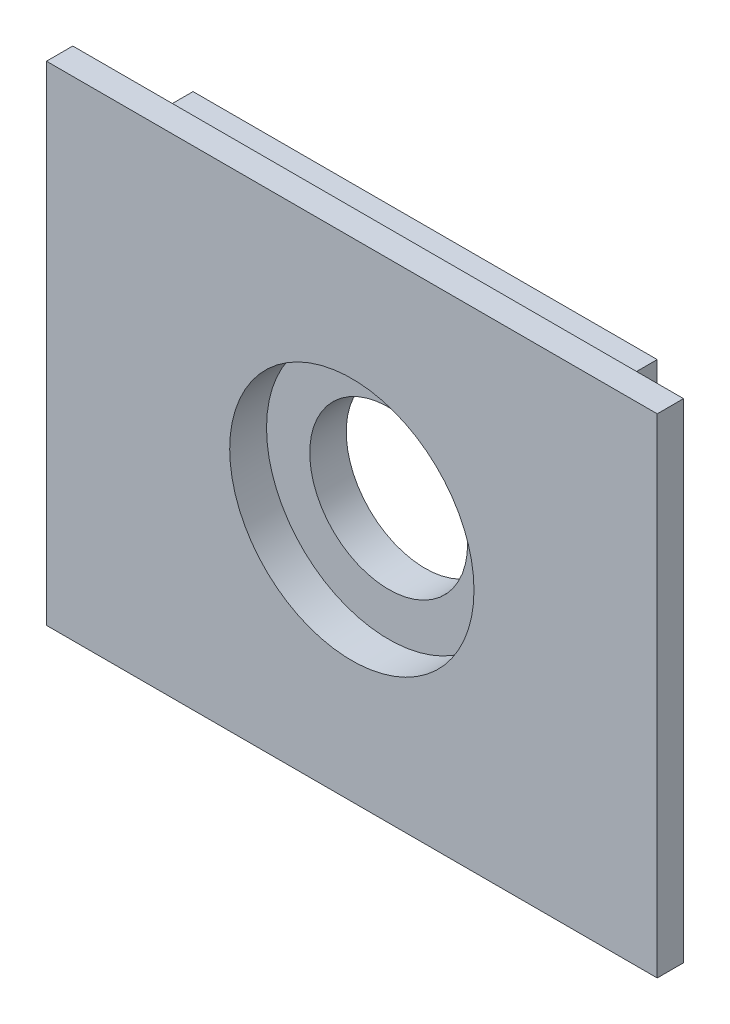
ISO-10303-21;
HEADER;
FILE_DESCRIPTION(('STEP AP214'),'2;1');
FILE_NAME('part.step','',(''),(''),'','','');
FILE_SCHEMA(('AUTOMOTIVE_DESIGN { 1 0 10303 214 1 1 1 1 }'));
ENDSEC;
DATA;
#1=APPLICATION_CONTEXT('core data for automotive mechanical design processes');
#2=APPLICATION_PROTOCOL_DEFINITION('international standard','automotive_design',2000,#1);
#3=PRODUCT_CONTEXT('',#1,'mechanical');
#4=PRODUCT('Part','Part','',(#3));
#5=PRODUCT_RELATED_PRODUCT_CATEGORY('part','',(#4));
#6=PRODUCT_DEFINITION_FORMATION('','',#4);
#7=PRODUCT_DEFINITION_CONTEXT('part definition',#1,'design');
#8=PRODUCT_DEFINITION('design','',#6,#7);
#9=PRODUCT_DEFINITION_SHAPE('','',#8);
#10=(LENGTH_UNIT() NAMED_UNIT(*) SI_UNIT(.MILLI.,.METRE.));
#11=(NAMED_UNIT(*) PLANE_ANGLE_UNIT() SI_UNIT($,.RADIAN.));
#12=(NAMED_UNIT(*) SI_UNIT($,.STERADIAN.) SOLID_ANGLE_UNIT());
#13=UNCERTAINTY_MEASURE_WITH_UNIT(LENGTH_MEASURE(1.E-05),#10,'distance_accuracy_value','');
#14=(GEOMETRIC_REPRESENTATION_CONTEXT(3) GLOBAL_UNCERTAINTY_ASSIGNED_CONTEXT((#13)) GLOBAL_UNIT_ASSIGNED_CONTEXT((#10,
#11,#12)) REPRESENTATION_CONTEXT('',''));
#15=CARTESIAN_POINT('',(0.,0.,0.));
#16=DIRECTION('',(0.,0.,1.));
#17=DIRECTION('',(1.,0.,0.));
#18=AXIS2_PLACEMENT_3D('',#15,#16,#17);
#19=CARTESIAN_POINT('',(0.,0.,-39.));
#20=DIRECTION('',(-1.,0.,0.));
#21=DIRECTION('',(0.,0.,1.));
#22=AXIS2_PLACEMENT_3D('',#19,#20,#21);
#23=PLANE('',#22);
#24=DIRECTION('',(0.,0.,1.));
#25=VECTOR('',#24,1.);
#26=CARTESIAN_POINT('',(0.,260.,-39.));
#27=LINE('',#26,#25);
#28=CARTESIAN_POINT('',(0.,260.,-14.));
#29=VERTEX_POINT('',#28);
#30=CARTESIAN_POINT('',(0.,260.,0.));
#31=VERTEX_POINT('',#30);
#32=EDGE_CURVE('E11',#29,#31,#27,.T.);
#33=ORIENTED_EDGE('',*,*,#32,.F.);
#34=DIRECTION('',(0.,1.,0.));
#35=VECTOR('',#34,1.);
#36=CARTESIAN_POINT('',(0.,260.,-14.));
#37=LINE('',#36,#35);
#38=CARTESIAN_POINT('',(0.,0.,-14.));
#39=VERTEX_POINT('',#38);
#40=EDGE_CURVE('E141',#39,#29,#37,.T.);
#41=ORIENTED_EDGE('',*,*,#40,.F.);
#42=DIRECTION('',(0.,0.,1.));
#43=VECTOR('',#42,1.);
#44=CARTESIAN_POINT('',(0.,0.,-39.));
#45=LINE('',#44,#43);
#46=CARTESIAN_POINT('',(0.,0.,0.));
#47=VERTEX_POINT('',#46);
#48=EDGE_CURVE('E165',#39,#47,#45,.T.);
#49=ORIENTED_EDGE('',*,*,#48,.T.);
#50=DIRECTION('',(0.,-1.,0.));
#51=VECTOR('',#50,1.);
#52=CARTESIAN_POINT('',(0.,0.,0.));
#53=LINE('',#52,#51);
#54=EDGE_CURVE('E151',#31,#47,#53,.T.);
#55=ORIENTED_EDGE('',*,*,#54,.F.);
#56=EDGE_LOOP('',(#33,#41,#49,#55));
#57=FACE_BOUND('',#56,.T.);
#58=ADVANCED_FACE('F33',(#57),#23,.T.);
#59=CARTESIAN_POINT('',(0.,260.,-39.));
#60=DIRECTION('',(0.,1.,0.));
#61=DIRECTION('',(0.,0.,1.));
#62=AXIS2_PLACEMENT_3D('',#59,#60,#61);
#63=PLANE('',#62);
#64=DIRECTION('',(0.,0.,1.));
#65=VECTOR('',#64,1.);
#66=CARTESIAN_POINT('',(325.,260.,-39.));
#67=LINE('',#66,#65);
#68=CARTESIAN_POINT('',(325.,260.,-14.));
#69=VERTEX_POINT('',#68);
#70=CARTESIAN_POINT('',(325.,260.,0.));
#71=VERTEX_POINT('',#70);
#72=EDGE_CURVE('E41',#69,#71,#67,.T.);
#73=ORIENTED_EDGE('',*,*,#72,.F.);
#74=DIRECTION('',(1.,0.,0.));
#75=VECTOR('',#74,1.);
#76=CARTESIAN_POINT('',(325.,260.,-14.));
#77=LINE('',#76,#75);
#78=EDGE_CURVE('E143',#29,#69,#77,.T.);
#79=ORIENTED_EDGE('',*,*,#78,.F.);
#80=ORIENTED_EDGE('',*,*,#32,.T.);
#81=DIRECTION('',(-1.,0.,0.));
#82=VECTOR('',#81,1.);
#83=CARTESIAN_POINT('',(0.,260.,0.));
#84=LINE('',#83,#82);
#85=EDGE_CURVE('E163',#71,#31,#84,.T.);
#86=ORIENTED_EDGE('',*,*,#85,.F.);
#87=EDGE_LOOP('',(#73,#79,#80,#86));
#88=FACE_BOUND('',#87,.T.);
#89=ADVANCED_FACE('F184',(#88),#63,.T.);
#90=CARTESIAN_POINT('',(325.,0.,-39.));
#91=DIRECTION('',(1.,0.,0.));
#92=DIRECTION('',(0.,0.,-1.));
#93=AXIS2_PLACEMENT_3D('',#90,#91,#92);
#94=PLANE('',#93);
#95=DIRECTION('',(0.,0.,1.));
#96=VECTOR('',#95,1.);
#97=CARTESIAN_POINT('',(325.,0.,-39.));
#98=LINE('',#97,#96);
#99=CARTESIAN_POINT('',(325.,0.,-14.));
#100=VERTEX_POINT('',#99);
#101=CARTESIAN_POINT('',(325.,0.,0.));
#102=VERTEX_POINT('',#101);
#103=EDGE_CURVE('E168',#100,#102,#98,.T.);
#104=ORIENTED_EDGE('',*,*,#103,.F.);
#105=DIRECTION('',(0.,-1.,0.));
#106=VECTOR('',#105,1.);
#107=CARTESIAN_POINT('',(325.,260.,-14.));
#108=LINE('',#107,#106);
#109=EDGE_CURVE('E49',#69,#100,#108,.T.);
#110=ORIENTED_EDGE('',*,*,#109,.F.);
#111=ORIENTED_EDGE('',*,*,#72,.T.);
#112=DIRECTION('',(0.,1.,0.));
#113=VECTOR('',#112,1.);
#114=CARTESIAN_POINT('',(325.,0.,0.));
#115=LINE('',#114,#113);
#116=EDGE_CURVE('E160',#102,#71,#115,.T.);
#117=ORIENTED_EDGE('',*,*,#116,.F.);
#118=EDGE_LOOP('',(#104,#110,#111,#117));
#119=FACE_BOUND('',#118,.T.);
#120=ADVANCED_FACE('F187',(#119),#94,.T.);
#121=CARTESIAN_POINT('',(0.,0.,-39.));
#122=DIRECTION('',(0.,-1.,0.));
#123=DIRECTION('',(0.,0.,-1.));
#124=AXIS2_PLACEMENT_3D('',#121,#122,#123);
#125=PLANE('',#124);
#126=ORIENTED_EDGE('',*,*,#48,.F.);
#127=DIRECTION('',(-1.,0.,0.));
#128=VECTOR('',#127,1.);
#129=CARTESIAN_POINT('',(325.,0.,-14.));
#130=LINE('',#129,#128);
#131=EDGE_CURVE('E139',#100,#39,#130,.T.);
#132=ORIENTED_EDGE('',*,*,#131,.F.);
#133=ORIENTED_EDGE('',*,*,#103,.T.);
#134=DIRECTION('',(1.,0.,0.));
#135=VECTOR('',#134,1.);
#136=CARTESIAN_POINT('',(0.,0.,0.));
#137=LINE('',#136,#135);
#138=EDGE_CURVE('E157',#47,#102,#137,.T.);
#139=ORIENTED_EDGE('',*,*,#138,.F.);
#140=EDGE_LOOP('',(#126,#132,#133,#139));
#141=FACE_BOUND('',#140,.T.);
#142=ADVANCED_FACE('F176',(#141),#125,.T.);
#143=CARTESIAN_POINT('',(0.,0.,-39.));
#144=DIRECTION('',(0.,0.,-1.));
#145=DIRECTION('',(-1.,0.,0.));
#146=AXIS2_PLACEMENT_3D('',#143,#144,#145);
#147=PLANE('',#146);
#148=CARTESIAN_POINT('',(162.5,130.,-39.));
#149=DIRECTION('',(0.,0.,1.));
#150=DIRECTION('',(1.,0.,0.));
#151=AXIS2_PLACEMENT_3D('',#148,#149,#150);
#152=CIRCLE('',#151,42.);
#153=CARTESIAN_POINT('',(204.5,130.,-39.));
#154=VERTEX_POINT('',#153);
#155=EDGE_CURVE('E145',#154,#154,#152,.T.);
#156=ORIENTED_EDGE('',*,*,#155,.T.);
#157=EDGE_LOOP('',(#156));
#158=FACE_BOUND('',#157,.T.);
#159=DIRECTION('',(1.,0.,0.));
#160=VECTOR('',#159,1.);
#161=CARTESIAN_POINT('',(286.,246.,-39.));
#162=LINE('',#161,#160);
#163=CARTESIAN_POINT('',(39.,246.,-39.));
#164=VERTEX_POINT('',#163);
#165=CARTESIAN_POINT('',(286.,246.,-39.));
#166=VERTEX_POINT('',#165);
#167=EDGE_CURVE('E123',#164,#166,#162,.T.);
#168=ORIENTED_EDGE('',*,*,#167,.T.);
#169=DIRECTION('',(0.,-1.,0.));
#170=VECTOR('',#169,1.);
#171=CARTESIAN_POINT('',(286.,246.,-39.));
#172=LINE('',#171,#170);
#173=CARTESIAN_POINT('',(286.,14.,-39.));
#174=VERTEX_POINT('',#173);
#175=EDGE_CURVE('E130',#166,#174,#172,.T.);
#176=ORIENTED_EDGE('',*,*,#175,.T.);
#177=DIRECTION('',(-1.,0.,0.));
#178=VECTOR('',#177,1.);
#179=CARTESIAN_POINT('',(286.,14.,-39.));
#180=LINE('',#179,#178);
#181=CARTESIAN_POINT('',(39.,14.,-39.));
#182=VERTEX_POINT('',#181);
#183=EDGE_CURVE('E104',#174,#182,#180,.T.);
#184=ORIENTED_EDGE('',*,*,#183,.T.);
#185=DIRECTION('',(0.,1.,0.));
#186=VECTOR('',#185,1.);
#187=CARTESIAN_POINT('',(39.,246.,-39.));
#188=LINE('',#187,#186);
#189=EDGE_CURVE('E57',#182,#164,#188,.T.);
#190=ORIENTED_EDGE('',*,*,#189,.T.);
#191=EDGE_LOOP('',(#168,#176,#184,#190));
#192=FACE_BOUND('',#191,.T.);
#193=ADVANCED_FACE('F194',(#158,#192),#147,.T.);
#194=CARTESIAN_POINT('',(0.,0.,0.));
#195=DIRECTION('',(0.,0.,-1.));
#196=DIRECTION('',(-1.,0.,0.));
#197=AXIS2_PLACEMENT_3D('',#194,#195,#196);
#198=PLANE('',#197);
#199=CARTESIAN_POINT('',(162.5,130.,0.));
#200=DIRECTION('',(0.,0.,1.));
#201=DIRECTION('',(1.,0.,0.));
#202=AXIS2_PLACEMENT_3D('',#199,#200,#201);
#203=CIRCLE('',#202,65.);
#204=CARTESIAN_POINT('',(227.5,130.,0.));
#205=VERTEX_POINT('',#204);
#206=EDGE_CURVE('E152',#205,#205,#203,.T.);
#207=ORIENTED_EDGE('',*,*,#206,.F.);
#208=EDGE_LOOP('',(#207));
#209=FACE_BOUND('',#208,.T.);
#210=ORIENTED_EDGE('',*,*,#54,.T.);
#211=ORIENTED_EDGE('',*,*,#138,.T.);
#212=ORIENTED_EDGE('',*,*,#116,.T.);
#213=ORIENTED_EDGE('',*,*,#85,.T.);
#214=EDGE_LOOP('',(#210,#211,#212,#213));
#215=FACE_BOUND('',#214,.T.);
#216=ADVANCED_FACE('F180',(#209,#215),#198,.F.);
#217=CARTESIAN_POINT('',(162.5,130.,-19.6));
#218=DIRECTION('',(0.,0.,1.));
#219=DIRECTION('',(1.,0.,0.));
#220=AXIS2_PLACEMENT_3D('',#217,#218,#219);
#221=CYLINDRICAL_SURFACE('',#220,65.);
#222=CARTESIAN_POINT('',(162.5,130.,-19.6));
#223=DIRECTION('',(0.,0.,1.));
#224=DIRECTION('',(1.,0.,0.));
#225=AXIS2_PLACEMENT_3D('',#222,#223,#224);
#226=CIRCLE('',#225,65.);
#227=CARTESIAN_POINT('',(227.5,130.,-19.6));
#228=VERTEX_POINT('',#227);
#229=EDGE_CURVE('E148',#228,#228,#226,.T.);
#230=ORIENTED_EDGE('',*,*,#229,.F.);
#231=EDGE_LOOP('',(#230));
#232=FACE_BOUND('',#231,.T.);
#233=ORIENTED_EDGE('',*,*,#206,.T.);
#234=EDGE_LOOP('',(#233));
#235=FACE_BOUND('',#234,.T.);
#236=ADVANCED_FACE('F280',(#232,#235),#221,.F.);
#237=CARTESIAN_POINT('',(162.5,130.,-19.6));
#238=DIRECTION('',(0.,0.,1.));
#239=DIRECTION('',(1.,0.,0.));
#240=AXIS2_PLACEMENT_3D('',#237,#238,#239);
#241=PLANE('',#240);
#242=CARTESIAN_POINT('',(162.5,130.,-19.6));
#243=DIRECTION('',(0.,0.,1.));
#244=DIRECTION('',(1.,0.,0.));
#245=AXIS2_PLACEMENT_3D('',#242,#243,#244);
#246=CIRCLE('',#245,42.);
#247=CARTESIAN_POINT('',(204.5,130.,-19.6));
#248=VERTEX_POINT('',#247);
#249=EDGE_CURVE('E36',#248,#248,#246,.T.);
#250=ORIENTED_EDGE('',*,*,#249,.F.);
#251=EDGE_LOOP('',(#250));
#252=FACE_BOUND('',#251,.T.);
#253=ORIENTED_EDGE('',*,*,#229,.T.);
#254=EDGE_LOOP('',(#253));
#255=FACE_BOUND('',#254,.T.);
#256=ADVANCED_FACE('F276',(#252,#255),#241,.T.);
#257=CARTESIAN_POINT('',(162.5,130.,-39.));
#258=DIRECTION('',(0.,0.,1.));
#259=DIRECTION('',(1.,0.,0.));
#260=AXIS2_PLACEMENT_3D('',#257,#258,#259);
#261=CYLINDRICAL_SURFACE('',#260,42.);
#262=ORIENTED_EDGE('',*,*,#249,.T.);
#263=EDGE_LOOP('',(#262));
#264=FACE_BOUND('',#263,.T.);
#265=ORIENTED_EDGE('',*,*,#155,.F.);
#266=EDGE_LOOP('',(#265));
#267=FACE_BOUND('',#266,.T.);
#268=ADVANCED_FACE('F234',(#264,#267),#261,.F.);
#269=CARTESIAN_POINT('',(0.,0.,-14.));
#270=DIRECTION('',(0.,0.,-1.));
#271=DIRECTION('',(-1.,0.,0.));
#272=AXIS2_PLACEMENT_3D('',#269,#270,#271);
#273=PLANE('',#272);
#274=DIRECTION('',(1.,0.,0.));
#275=VECTOR('',#274,1.);
#276=CARTESIAN_POINT('',(286.,246.,-14.));
#277=LINE('',#276,#275);
#278=CARTESIAN_POINT('',(39.,246.,-14.));
#279=VERTEX_POINT('',#278);
#280=CARTESIAN_POINT('',(286.,246.,-14.));
#281=VERTEX_POINT('',#280);
#282=EDGE_CURVE('E110',#279,#281,#277,.T.);
#283=ORIENTED_EDGE('',*,*,#282,.F.);
#284=DIRECTION('',(0.,1.,0.));
#285=VECTOR('',#284,1.);
#286=CARTESIAN_POINT('',(39.,246.,-14.));
#287=LINE('',#286,#285);
#288=CARTESIAN_POINT('',(39.,14.,-14.));
#289=VERTEX_POINT('',#288);
#290=EDGE_CURVE('E119',#289,#279,#287,.T.);
#291=ORIENTED_EDGE('',*,*,#290,.F.);
#292=DIRECTION('',(-1.,0.,0.));
#293=VECTOR('',#292,1.);
#294=CARTESIAN_POINT('',(286.,14.,-14.));
#295=LINE('',#294,#293);
#296=CARTESIAN_POINT('',(286.,14.,-14.));
#297=VERTEX_POINT('',#296);
#298=EDGE_CURVE('E102',#297,#289,#295,.T.);
#299=ORIENTED_EDGE('',*,*,#298,.F.);
#300=DIRECTION('',(0.,-1.,0.));
#301=VECTOR('',#300,1.);
#302=CARTESIAN_POINT('',(286.,246.,-14.));
#303=LINE('',#302,#301);
#304=EDGE_CURVE('E116',#281,#297,#303,.T.);
#305=ORIENTED_EDGE('',*,*,#304,.F.);
#306=EDGE_LOOP('',(#283,#291,#299,#305));
#307=FACE_BOUND('',#306,.T.);
#308=ORIENTED_EDGE('',*,*,#109,.T.);
#309=ORIENTED_EDGE('',*,*,#131,.T.);
#310=ORIENTED_EDGE('',*,*,#40,.T.);
#311=ORIENTED_EDGE('',*,*,#78,.T.);
#312=EDGE_LOOP('',(#308,#309,#310,#311));
#313=FACE_BOUND('',#312,.T.);
#314=ADVANCED_FACE('F115',(#307,#313),#273,.T.);
#315=CARTESIAN_POINT('',(286.,246.,-14.));
#316=DIRECTION('',(1.,0.,0.));
#317=DIRECTION('',(0.,0.,-1.));
#318=AXIS2_PLACEMENT_3D('',#315,#316,#317);
#319=PLANE('',#318);
#320=ORIENTED_EDGE('',*,*,#175,.F.);
#321=DIRECTION('',(0.,0.,-1.));
#322=VECTOR('',#321,1.);
#323=CARTESIAN_POINT('',(286.,246.,-14.));
#324=LINE('',#323,#322);
#325=EDGE_CURVE('E122',#281,#166,#324,.T.);
#326=ORIENTED_EDGE('',*,*,#325,.F.);
#327=ORIENTED_EDGE('',*,*,#304,.T.);
#328=DIRECTION('',(0.,0.,-1.));
#329=VECTOR('',#328,1.);
#330=CARTESIAN_POINT('',(286.,14.,-14.));
#331=LINE('',#330,#329);
#332=EDGE_CURVE('E99',#297,#174,#331,.T.);
#333=ORIENTED_EDGE('',*,*,#332,.T.);
#334=EDGE_LOOP('',(#320,#326,#327,#333));
#335=FACE_BOUND('',#334,.T.);
#336=ADVANCED_FACE('F121',(#335),#319,.T.);
#337=CARTESIAN_POINT('',(286.,246.,-14.));
#338=DIRECTION('',(0.,1.,0.));
#339=DIRECTION('',(0.,0.,1.));
#340=AXIS2_PLACEMENT_3D('',#337,#338,#339);
#341=PLANE('',#340);
#342=ORIENTED_EDGE('',*,*,#167,.F.);
#343=DIRECTION('',(0.,0.,-1.));
#344=VECTOR('',#343,1.);
#345=CARTESIAN_POINT('',(39.,246.,-14.));
#346=LINE('',#345,#344);
#347=EDGE_CURVE('E135',#279,#164,#346,.T.);
#348=ORIENTED_EDGE('',*,*,#347,.F.);
#349=ORIENTED_EDGE('',*,*,#282,.T.);
#350=ORIENTED_EDGE('',*,*,#325,.T.);
#351=EDGE_LOOP('',(#342,#348,#349,#350));
#352=FACE_BOUND('',#351,.T.);
#353=ADVANCED_FACE('F244',(#352),#341,.T.);
#354=CARTESIAN_POINT('',(39.,246.,-14.));
#355=DIRECTION('',(-1.,0.,0.));
#356=DIRECTION('',(0.,0.,1.));
#357=AXIS2_PLACEMENT_3D('',#354,#355,#356);
#358=PLANE('',#357);
#359=ORIENTED_EDGE('',*,*,#189,.F.);
#360=DIRECTION('',(0.,0.,-1.));
#361=VECTOR('',#360,1.);
#362=CARTESIAN_POINT('',(39.,14.,-14.));
#363=LINE('',#362,#361);
#364=EDGE_CURVE('E109',#289,#182,#363,.T.);
#365=ORIENTED_EDGE('',*,*,#364,.F.);
#366=ORIENTED_EDGE('',*,*,#290,.T.);
#367=ORIENTED_EDGE('',*,*,#347,.T.);
#368=EDGE_LOOP('',(#359,#365,#366,#367));
#369=FACE_BOUND('',#368,.T.);
#370=ADVANCED_FACE('F253',(#369),#358,.T.);
#371=CARTESIAN_POINT('',(286.,14.,-14.));
#372=DIRECTION('',(0.,-1.,0.));
#373=DIRECTION('',(0.,0.,-1.));
#374=AXIS2_PLACEMENT_3D('',#371,#372,#373);
#375=PLANE('',#374);
#376=ORIENTED_EDGE('',*,*,#183,.F.);
#377=ORIENTED_EDGE('',*,*,#332,.F.);
#378=ORIENTED_EDGE('',*,*,#298,.T.);
#379=ORIENTED_EDGE('',*,*,#364,.T.);
#380=EDGE_LOOP('',(#376,#377,#378,#379));
#381=FACE_BOUND('',#380,.T.);
#382=ADVANCED_FACE('F101',(#381),#375,.T.);
#383=CLOSED_SHELL('',(#58,#89,#120,#142,#193,#216,#236,#256,#268,#314,#336,#353,#370,#382));
#384=MANIFOLD_SOLID_BREP('B2',#383);
#385=ADVANCED_BREP_SHAPE_REPRESENTATION('',(#18,#384),#14);
#386=SHAPE_DEFINITION_REPRESENTATION(#9,#385);
ENDSEC;
END-ISO-10303-21;
